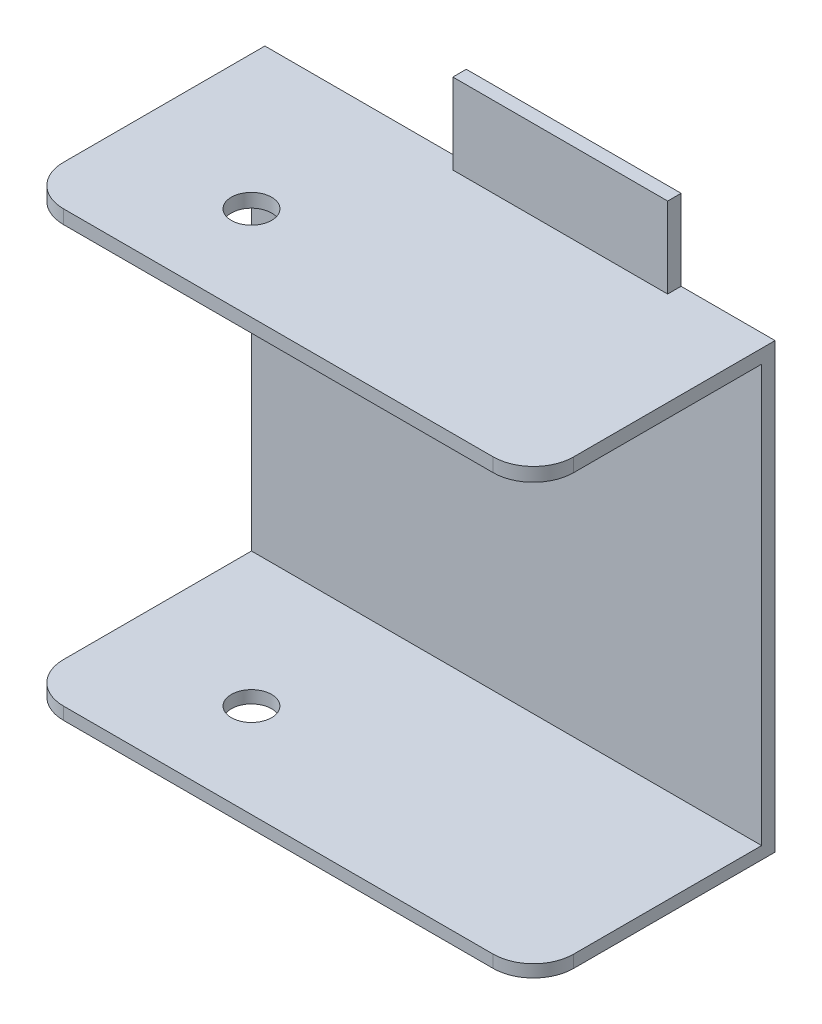
ISO-10303-21;
HEADER;
FILE_DESCRIPTION(('STEP AP214'),'2;1');
FILE_NAME('part.step','',(''),(''),'','','');
FILE_SCHEMA(('AUTOMOTIVE_DESIGN { 1 0 10303 214 1 1 1 1 }'));
ENDSEC;
DATA;
#1=APPLICATION_CONTEXT('core data for automotive mechanical design processes');
#2=APPLICATION_PROTOCOL_DEFINITION('international standard','automotive_design',2000,#1);
#3=PRODUCT_CONTEXT('',#1,'mechanical');
#4=PRODUCT('Part','Part','',(#3));
#5=PRODUCT_RELATED_PRODUCT_CATEGORY('part','',(#4));
#6=PRODUCT_DEFINITION_FORMATION('','',#4);
#7=PRODUCT_DEFINITION_CONTEXT('part definition',#1,'design');
#8=PRODUCT_DEFINITION('design','',#6,#7);
#9=PRODUCT_DEFINITION_SHAPE('','',#8);
#10=(LENGTH_UNIT() NAMED_UNIT(*) SI_UNIT(.MILLI.,.METRE.));
#11=(NAMED_UNIT(*) PLANE_ANGLE_UNIT() SI_UNIT($,.RADIAN.));
#12=(NAMED_UNIT(*) SI_UNIT($,.STERADIAN.) SOLID_ANGLE_UNIT());
#13=UNCERTAINTY_MEASURE_WITH_UNIT(LENGTH_MEASURE(1.E-05),#10,'distance_accuracy_value','');
#14=(GEOMETRIC_REPRESENTATION_CONTEXT(3) GLOBAL_UNCERTAINTY_ASSIGNED_CONTEXT((#13)) GLOBAL_UNIT_ASSIGNED_CONTEXT((#10,
#11,#12)) REPRESENTATION_CONTEXT('',''));
#15=CARTESIAN_POINT('',(0.,0.,0.));
#16=DIRECTION('',(0.,0.,1.));
#17=DIRECTION('',(1.,0.,0.));
#18=AXIS2_PLACEMENT_3D('',#15,#16,#17);
#19=CARTESIAN_POINT('',(-37.9891725352113,10.7390180319361,1.));
#20=DIRECTION('',(0.,0.,1.));
#21=DIRECTION('',(1.,0.,0.));
#22=AXIS2_PLACEMENT_3D('',#19,#20,#21);
#23=PLANE('',#22);
#24=DIRECTION('',(0.,1.,0.));
#25=VECTOR('',#24,1.);
#26=CARTESIAN_POINT('',(-37.9891725352113,-28.2609819680639,1.));
#27=LINE('',#26,#25);
#28=CARTESIAN_POINT('',(-37.9891725352113,-28.2609819680639,1.));
#29=VERTEX_POINT('',#28);
#30=CARTESIAN_POINT('',(-37.9891725352113,-22.2609819680639,1.));
#31=VERTEX_POINT('',#30);
#32=EDGE_CURVE('E223',#29,#31,#27,.T.);
#33=ORIENTED_EDGE('',*,*,#32,.T.);
#34=DIRECTION('',(-1.,0.,0.));
#35=VECTOR('',#34,1.);
#36=CARTESIAN_POINT('',(-37.9891725352113,-22.2609819680639,1.));
#37=LINE('',#36,#35);
#38=CARTESIAN_POINT('',(-53.9891725352113,-22.2609819680639,1.));
#39=VERTEX_POINT('',#38);
#40=EDGE_CURVE('E237',#31,#39,#37,.T.);
#41=ORIENTED_EDGE('',*,*,#40,.T.);
#42=DIRECTION('',(0.,-1.,0.));
#43=VECTOR('',#42,1.);
#44=CARTESIAN_POINT('',(-53.9891725352113,-28.2609819680639,1.));
#45=LINE('',#44,#43);
#46=CARTESIAN_POINT('',(-53.9891725352113,-28.2609819680639,1.));
#47=VERTEX_POINT('',#46);
#48=EDGE_CURVE('E204',#39,#47,#45,.T.);
#49=ORIENTED_EDGE('',*,*,#48,.T.);
#50=DIRECTION('',(1.,0.,0.));
#51=VECTOR('',#50,1.);
#52=CARTESIAN_POINT('',(-53.9891725352113,-28.2609819680639,1.));
#53=LINE('',#52,#51);
#54=EDGE_CURVE('E207',#47,#29,#53,.T.);
#55=ORIENTED_EDGE('',*,*,#54,.T.);
#56=EDGE_LOOP('',(#33,#41,#49,#55));
#57=FACE_BOUND('',#56,.T.);
#58=ADVANCED_FACE('F36',(#57),#23,.T.);
#59=DIRECTION('',(0.,-1.,0.));
#60=VECTOR('',#59,1.);
#61=CARTESIAN_POINT('',(-68.9891725352113,10.7390180319361,1.));
#62=LINE('',#61,#60);
#63=CARTESIAN_POINT('',(-68.9891725352113,9.71774900362483,1.));
#64=VERTEX_POINT('',#63);
#65=CARTESIAN_POINT('',(-68.9891725352113,-21.3364550083257,1.));
#66=VERTEX_POINT('',#65);
#67=EDGE_CURVE('E182',#64,#66,#62,.T.);
#68=ORIENTED_EDGE('',*,*,#67,.T.);
#69=DIRECTION('',(-1.,0.,0.));
#70=VECTOR('',#69,1.);
#71=CARTESIAN_POINT('',(-68.9891725352113,-21.3364550083257,1.));
#72=LINE('',#71,#70);
#73=CARTESIAN_POINT('',(-30.9891725352113,-21.3364550083257,1.));
#74=VERTEX_POINT('',#73);
#75=EDGE_CURVE('E191',#74,#66,#72,.T.);
#76=ORIENTED_EDGE('',*,*,#75,.F.);
#77=DIRECTION('',(0.,1.,0.));
#78=VECTOR('',#77,1.);
#79=CARTESIAN_POINT('',(-30.9891725352113,10.7390180319361,1.));
#80=LINE('',#79,#78);
#81=CARTESIAN_POINT('',(-30.9891725352113,9.71774900362483,1.));
#82=VERTEX_POINT('',#81);
#83=EDGE_CURVE('E226',#74,#82,#80,.T.);
#84=ORIENTED_EDGE('',*,*,#83,.T.);
#85=DIRECTION('',(1.,0.,0.));
#86=VECTOR('',#85,1.);
#87=CARTESIAN_POINT('',(-68.9891725352113,9.71774900362483,1.));
#88=LINE('',#87,#86);
#89=EDGE_CURVE('E203',#64,#82,#88,.T.);
#90=ORIENTED_EDGE('',*,*,#89,.F.);
#91=EDGE_LOOP('',(#68,#76,#84,#90));
#92=FACE_BOUND('',#91,.T.);
#93=ADVANCED_FACE('F201',(#92),#23,.T.);
#94=DIRECTION('',(-1.,0.,0.));
#95=VECTOR('',#94,1.);
#96=CARTESIAN_POINT('',(-68.9891725352113,10.7390180319361,1.));
#97=LINE('',#96,#95);
#98=CARTESIAN_POINT('',(-37.9891725352113,10.7390180319361,1.));
#99=VERTEX_POINT('',#98);
#100=CARTESIAN_POINT('',(-53.9891725352113,10.7390180319361,1.));
#101=VERTEX_POINT('',#100);
#102=EDGE_CURVE('E240',#99,#101,#97,.T.);
#103=ORIENTED_EDGE('',*,*,#102,.F.);
#104=DIRECTION('',(0.,1.,0.));
#105=VECTOR('',#104,1.);
#106=CARTESIAN_POINT('',(-37.9891725352113,16.7390180319361,1.));
#107=LINE('',#106,#105);
#108=CARTESIAN_POINT('',(-37.9891725352113,16.7390180319361,1.));
#109=VERTEX_POINT('',#108);
#110=EDGE_CURVE('E272',#99,#109,#107,.T.);
#111=ORIENTED_EDGE('',*,*,#110,.T.);
#112=DIRECTION('',(-1.,0.,0.));
#113=VECTOR('',#112,1.);
#114=CARTESIAN_POINT('',(-53.9891725352113,16.7390180319361,1.));
#115=LINE('',#114,#113);
#116=CARTESIAN_POINT('',(-53.9891725352113,16.7390180319361,1.));
#117=VERTEX_POINT('',#116);
#118=EDGE_CURVE('E209',#109,#117,#115,.T.);
#119=ORIENTED_EDGE('',*,*,#118,.T.);
#120=DIRECTION('',(0.,-1.,0.));
#121=VECTOR('',#120,1.);
#122=CARTESIAN_POINT('',(-53.9891725352113,16.7390180319361,1.));
#123=LINE('',#122,#121);
#124=EDGE_CURVE('E205',#117,#101,#123,.T.);
#125=ORIENTED_EDGE('',*,*,#124,.T.);
#126=EDGE_LOOP('',(#103,#111,#119,#125));
#127=FACE_BOUND('',#126,.T.);
#128=ADVANCED_FACE('F345',(#127),#23,.T.);
#129=CARTESIAN_POINT('',(-37.9891725352113,16.7390180319361,1.));
#130=DIRECTION('',(-1.,0.,0.));
#131=DIRECTION('',(0.,0.,1.));
#132=AXIS2_PLACEMENT_3D('',#129,#130,#131);
#133=PLANE('',#132);
#134=DIRECTION('',(0.,1.,0.));
#135=VECTOR('',#134,1.);
#136=CARTESIAN_POINT('',(-37.9891725352113,16.7390180319361,0.));
#137=LINE('',#136,#135);
#138=CARTESIAN_POINT('',(-37.9891725352113,10.7390180319361,0.));
#139=VERTEX_POINT('',#138);
#140=CARTESIAN_POINT('',(-37.9891725352113,16.7390180319361,0.));
#141=VERTEX_POINT('',#140);
#142=EDGE_CURVE('E332',#139,#141,#137,.T.);
#143=ORIENTED_EDGE('',*,*,#142,.T.);
#144=DIRECTION('',(0.,0.,-1.));
#145=VECTOR('',#144,1.);
#146=CARTESIAN_POINT('',(-37.9891725352113,16.7390180319361,1.));
#147=LINE('',#146,#145);
#148=EDGE_CURVE('E214',#109,#141,#147,.T.);
#149=ORIENTED_EDGE('',*,*,#148,.F.);
#150=ORIENTED_EDGE('',*,*,#110,.F.);
#151=DIRECTION('',(0.,0.,-1.));
#152=VECTOR('',#151,1.);
#153=CARTESIAN_POINT('',(-37.9891725352113,10.7390180319361,1.));
#154=LINE('',#153,#152);
#155=EDGE_CURVE('E261',#99,#139,#154,.T.);
#156=ORIENTED_EDGE('',*,*,#155,.T.);
#157=EDGE_LOOP('',(#143,#149,#150,#156));
#158=FACE_BOUND('',#157,.T.);
#159=ADVANCED_FACE('F346',(#158),#133,.F.);
#160=CARTESIAN_POINT('',(-53.9891725352113,16.7390180319361,1.));
#161=DIRECTION('',(0.,-1.,0.));
#162=DIRECTION('',(0.,0.,-1.));
#163=AXIS2_PLACEMENT_3D('',#160,#161,#162);
#164=PLANE('',#163);
#165=DIRECTION('',(-1.,0.,0.));
#166=VECTOR('',#165,1.);
#167=CARTESIAN_POINT('',(-53.9891725352113,16.7390180319361,0.));
#168=LINE('',#167,#166);
#169=CARTESIAN_POINT('',(-53.9891725352113,16.7390180319361,0.));
#170=VERTEX_POINT('',#169);
#171=EDGE_CURVE('E331',#141,#170,#168,.T.);
#172=ORIENTED_EDGE('',*,*,#171,.T.);
#173=DIRECTION('',(0.,0.,-1.));
#174=VECTOR('',#173,1.);
#175=CARTESIAN_POINT('',(-53.9891725352113,16.7390180319361,1.));
#176=LINE('',#175,#174);
#177=EDGE_CURVE('E268',#117,#170,#176,.T.);
#178=ORIENTED_EDGE('',*,*,#177,.F.);
#179=ORIENTED_EDGE('',*,*,#118,.F.);
#180=ORIENTED_EDGE('',*,*,#148,.T.);
#181=EDGE_LOOP('',(#172,#178,#179,#180));
#182=FACE_BOUND('',#181,.T.);
#183=ADVANCED_FACE('F341',(#182),#164,.F.);
#184=CARTESIAN_POINT('',(-53.9891725352113,16.7390180319361,1.));
#185=DIRECTION('',(1.,0.,0.));
#186=DIRECTION('',(0.,0.,-1.));
#187=AXIS2_PLACEMENT_3D('',#184,#185,#186);
#188=PLANE('',#187);
#189=DIRECTION('',(0.,-1.,0.));
#190=VECTOR('',#189,1.);
#191=CARTESIAN_POINT('',(-53.9891725352113,16.7390180319361,0.));
#192=LINE('',#191,#190);
#193=CARTESIAN_POINT('',(-53.9891725352113,10.7390180319361,0.));
#194=VERTEX_POINT('',#193);
#195=EDGE_CURVE('E329',#170,#194,#192,.T.);
#196=ORIENTED_EDGE('',*,*,#195,.T.);
#197=DIRECTION('',(0.,0.,-1.));
#198=VECTOR('',#197,1.);
#199=CARTESIAN_POINT('',(-53.9891725352113,10.7390180319361,1.));
#200=LINE('',#199,#198);
#201=EDGE_CURVE('E265',#101,#194,#200,.T.);
#202=ORIENTED_EDGE('',*,*,#201,.F.);
#203=ORIENTED_EDGE('',*,*,#124,.F.);
#204=ORIENTED_EDGE('',*,*,#177,.T.);
#205=EDGE_LOOP('',(#196,#202,#203,#204));
#206=FACE_BOUND('',#205,.T.);
#207=ADVANCED_FACE('F343',(#206),#188,.F.);
#208=CARTESIAN_POINT('',(-68.9891725352113,10.7390180319361,1.));
#209=DIRECTION('',(0.,-1.,0.));
#210=DIRECTION('',(0.,0.,-1.));
#211=AXIS2_PLACEMENT_3D('',#208,#209,#210);
#212=PLANE('',#211);
#213=CARTESIAN_POINT('',(-58.9891725352113,10.7390180319361,11.));
#214=DIRECTION('',(0.,1.,0.));
#215=DIRECTION('',(0.,0.,1.));
#216=AXIS2_PLACEMENT_3D('',#213,#214,#215);
#217=CIRCLE('',#216,1.5);
#218=CARTESIAN_POINT('',(-58.9891725352113,10.7390180319361,12.5));
#219=VERTEX_POINT('',#218);
#220=EDGE_CURVE('E638',#219,#219,#217,.T.);
#221=ORIENTED_EDGE('',*,*,#220,.F.);
#222=EDGE_LOOP('',(#221));
#223=FACE_BOUND('',#222,.T.);
#224=DIRECTION('',(-1.,0.,0.));
#225=VECTOR('',#224,1.);
#226=CARTESIAN_POINT('',(-68.9891725352113,10.7390180319361,18.));
#227=LINE('',#226,#225);
#228=CARTESIAN_POINT('',(-33.9891725352113,10.7390180319361,18.));
#229=VERTEX_POINT('',#228);
#230=CARTESIAN_POINT('',(-65.9891725352113,10.7390180319361,18.));
#231=VERTEX_POINT('',#230);
#232=EDGE_CURVE('E656',#229,#231,#227,.T.);
#233=ORIENTED_EDGE('',*,*,#232,.F.);
#234=CARTESIAN_POINT('',(-33.9891725352113,10.7390180319361,15.));
#235=DIRECTION('',(0.,-1.,0.));
#236=DIRECTION('',(0.,0.,-1.));
#237=AXIS2_PLACEMENT_3D('',#234,#235,#236);
#238=CIRCLE('',#237,3.);
#239=CARTESIAN_POINT('',(-30.9891725352113,10.7390180319361,15.));
#240=VERTEX_POINT('',#239);
#241=EDGE_CURVE('E60',#229,#240,#238,.F.);
#242=ORIENTED_EDGE('',*,*,#241,.T.);
#243=DIRECTION('',(0.,0.,-1.));
#244=VECTOR('',#243,1.);
#245=CARTESIAN_POINT('',(-30.9891725352113,10.7390180319361,1.));
#246=LINE('',#245,#244);
#247=CARTESIAN_POINT('',(-30.9891725352113,10.7390180319361,0.));
#248=VERTEX_POINT('',#247);
#249=EDGE_CURVE('E234',#240,#248,#246,.T.);
#250=ORIENTED_EDGE('',*,*,#249,.T.);
#251=DIRECTION('',(-1.,0.,0.));
#252=VECTOR('',#251,1.);
#253=CARTESIAN_POINT('',(-37.9891725352113,10.7390180319361,0.));
#254=LINE('',#253,#252);
#255=EDGE_CURVE('E229',#248,#139,#254,.T.);
#256=ORIENTED_EDGE('',*,*,#255,.T.);
#257=ORIENTED_EDGE('',*,*,#155,.F.);
#258=ORIENTED_EDGE('',*,*,#102,.T.);
#259=ORIENTED_EDGE('',*,*,#201,.T.);
#260=DIRECTION('',(-1.,0.,0.));
#261=VECTOR('',#260,1.);
#262=CARTESIAN_POINT('',(-68.9891725352113,10.7390180319361,0.));
#263=LINE('',#262,#261);
#264=CARTESIAN_POINT('',(-68.9891725352113,10.7390180319361,0.));
#265=VERTEX_POINT('',#264);
#266=EDGE_CURVE('E326',#194,#265,#263,.T.);
#267=ORIENTED_EDGE('',*,*,#266,.T.);
#268=DIRECTION('',(0.,0.,-1.));
#269=VECTOR('',#268,1.);
#270=CARTESIAN_POINT('',(-68.9891725352113,10.7390180319361,1.));
#271=LINE('',#270,#269);
#272=CARTESIAN_POINT('',(-68.9891725352113,10.7390180319361,15.));
#273=VERTEX_POINT('',#272);
#274=EDGE_CURVE('E269',#273,#265,#271,.T.);
#275=ORIENTED_EDGE('',*,*,#274,.F.);
#276=CARTESIAN_POINT('',(-65.9891725352113,10.7390180319361,15.));
#277=DIRECTION('',(0.,-1.,0.));
#278=DIRECTION('',(0.,0.,-1.));
#279=AXIS2_PLACEMENT_3D('',#276,#277,#278);
#280=CIRCLE('',#279,3.);
#281=EDGE_CURVE('E52',#273,#231,#280,.F.);
#282=ORIENTED_EDGE('',*,*,#281,.T.);
#283=EDGE_LOOP('',(#233,#242,#250,#256,#257,#258,#259,#267,#275,#282));
#284=FACE_BOUND('',#283,.T.);
#285=ADVANCED_FACE('F334',(#223,#284),#212,.F.);
#286=CARTESIAN_POINT('',(-68.9891725352113,10.7390180319361,1.));
#287=DIRECTION('',(1.,0.,0.));
#288=DIRECTION('',(0.,0.,-1.));
#289=AXIS2_PLACEMENT_3D('',#286,#287,#288);
#290=PLANE('',#289);
#291=DIRECTION('',(0.,0.,-1.));
#292=VECTOR('',#291,1.);
#293=CARTESIAN_POINT('',(-68.9891725352113,-22.2609819680639,1.));
#294=LINE('',#293,#292);
#295=CARTESIAN_POINT('',(-68.9891725352113,-22.2609819680639,15.));
#296=VERTEX_POINT('',#295);
#297=CARTESIAN_POINT('',(-68.9891725352113,-22.2609819680639,0.));
#298=VERTEX_POINT('',#297);
#299=EDGE_CURVE('E293',#296,#298,#294,.T.);
#300=ORIENTED_EDGE('',*,*,#299,.F.);
#301=DIRECTION('',(0.,-1.,0.));
#302=VECTOR('',#301,1.);
#303=CARTESIAN_POINT('',(-68.9891725352113,10.7390180319361,15.));
#304=LINE('',#303,#302);
#305=CARTESIAN_POINT('',(-68.9891725352113,-21.3364550083257,15.));
#306=VERTEX_POINT('',#305);
#307=EDGE_CURVE('E184',#296,#306,#304,.F.);
#308=ORIENTED_EDGE('',*,*,#307,.T.);
#309=DIRECTION('',(0.,0.,-1.));
#310=VECTOR('',#309,1.);
#311=CARTESIAN_POINT('',(-68.9891725352113,-21.3364550083257,18.));
#312=LINE('',#311,#310);
#313=EDGE_CURVE('E176',#306,#66,#312,.T.);
#314=ORIENTED_EDGE('',*,*,#313,.T.);
#315=ORIENTED_EDGE('',*,*,#67,.F.);
#316=DIRECTION('',(0.,0.,-1.));
#317=VECTOR('',#316,1.);
#318=CARTESIAN_POINT('',(-68.9891725352113,9.71774900362483,18.));
#319=LINE('',#318,#317);
#320=CARTESIAN_POINT('',(-68.9891725352113,9.71774900362483,15.));
#321=VERTEX_POINT('',#320);
#322=EDGE_CURVE('E251',#321,#64,#319,.T.);
#323=ORIENTED_EDGE('',*,*,#322,.F.);
#324=DIRECTION('',(0.,-1.,0.));
#325=VECTOR('',#324,1.);
#326=CARTESIAN_POINT('',(-68.9891725352113,10.7390180319361,15.));
#327=LINE('',#326,#325);
#328=EDGE_CURVE('E250',#321,#273,#327,.F.);
#329=ORIENTED_EDGE('',*,*,#328,.T.);
#330=ORIENTED_EDGE('',*,*,#274,.T.);
#331=DIRECTION('',(0.,-1.,0.));
#332=VECTOR('',#331,1.);
#333=CARTESIAN_POINT('',(-68.9891725352113,10.7390180319361,0.));
#334=LINE('',#333,#332);
#335=EDGE_CURVE('E323',#265,#298,#334,.T.);
#336=ORIENTED_EDGE('',*,*,#335,.T.);
#337=EDGE_LOOP('',(#300,#308,#314,#315,#323,#329,#330,#336));
#338=FACE_BOUND('',#337,.T.);
#339=ADVANCED_FACE('F179',(#338),#290,.F.);
#340=CARTESIAN_POINT('',(-53.9891725352113,-28.2609819680639,1.));
#341=DIRECTION('',(1.,0.,0.));
#342=DIRECTION('',(0.,0.,-1.));
#343=AXIS2_PLACEMENT_3D('',#340,#341,#342);
#344=PLANE('',#343);
#345=DIRECTION('',(0.,-1.,0.));
#346=VECTOR('',#345,1.);
#347=CARTESIAN_POINT('',(-53.9891725352113,-28.2609819680639,0.));
#348=LINE('',#347,#346);
#349=CARTESIAN_POINT('',(-53.9891725352113,-22.2609819680639,0.));
#350=VERTEX_POINT('',#349);
#351=CARTESIAN_POINT('',(-53.9891725352113,-28.2609819680639,0.));
#352=VERTEX_POINT('',#351);
#353=EDGE_CURVE('E319',#350,#352,#348,.T.);
#354=ORIENTED_EDGE('',*,*,#353,.T.);
#355=DIRECTION('',(0.,0.,-1.));
#356=VECTOR('',#355,1.);
#357=CARTESIAN_POINT('',(-53.9891725352113,-28.2609819680639,1.));
#358=LINE('',#357,#356);
#359=EDGE_CURVE('E298',#47,#352,#358,.T.);
#360=ORIENTED_EDGE('',*,*,#359,.F.);
#361=ORIENTED_EDGE('',*,*,#48,.F.);
#362=DIRECTION('',(0.,0.,-1.));
#363=VECTOR('',#362,1.);
#364=CARTESIAN_POINT('',(-53.9891725352113,-22.2609819680639,1.));
#365=LINE('',#364,#363);
#366=EDGE_CURVE('E295',#39,#350,#365,.T.);
#367=ORIENTED_EDGE('',*,*,#366,.T.);
#368=EDGE_LOOP('',(#354,#360,#361,#367));
#369=FACE_BOUND('',#368,.T.);
#370=ADVANCED_FACE('F382',(#369),#344,.F.);
#371=CARTESIAN_POINT('',(-53.9891725352113,-28.2609819680639,1.));
#372=DIRECTION('',(0.,1.,0.));
#373=DIRECTION('',(0.,0.,1.));
#374=AXIS2_PLACEMENT_3D('',#371,#372,#373);
#375=PLANE('',#374);
#376=DIRECTION('',(1.,0.,0.));
#377=VECTOR('',#376,1.);
#378=CARTESIAN_POINT('',(-53.9891725352113,-28.2609819680639,0.));
#379=LINE('',#378,#377);
#380=CARTESIAN_POINT('',(-37.9891725352113,-28.2609819680639,0.));
#381=VERTEX_POINT('',#380);
#382=EDGE_CURVE('E317',#352,#381,#379,.T.);
#383=ORIENTED_EDGE('',*,*,#382,.T.);
#384=DIRECTION('',(0.,0.,-1.));
#385=VECTOR('',#384,1.);
#386=CARTESIAN_POINT('',(-37.9891725352113,-28.2609819680639,1.));
#387=LINE('',#386,#385);
#388=EDGE_CURVE('E301',#29,#381,#387,.T.);
#389=ORIENTED_EDGE('',*,*,#388,.F.);
#390=ORIENTED_EDGE('',*,*,#54,.F.);
#391=ORIENTED_EDGE('',*,*,#359,.T.);
#392=EDGE_LOOP('',(#383,#389,#390,#391));
#393=FACE_BOUND('',#392,.T.);
#394=ADVANCED_FACE('F378',(#393),#375,.F.);
#395=CARTESIAN_POINT('',(-37.9891725352113,-28.2609819680639,1.));
#396=DIRECTION('',(-1.,0.,0.));
#397=DIRECTION('',(0.,0.,1.));
#398=AXIS2_PLACEMENT_3D('',#395,#396,#397);
#399=PLANE('',#398);
#400=DIRECTION('',(0.,1.,0.));
#401=VECTOR('',#400,1.);
#402=CARTESIAN_POINT('',(-37.9891725352113,-28.2609819680639,0.));
#403=LINE('',#402,#401);
#404=CARTESIAN_POINT('',(-37.9891725352113,-22.2609819680639,0.));
#405=VERTEX_POINT('',#404);
#406=EDGE_CURVE('E315',#381,#405,#403,.T.);
#407=ORIENTED_EDGE('',*,*,#406,.T.);
#408=DIRECTION('',(0.,0.,-1.));
#409=VECTOR('',#408,1.);
#410=CARTESIAN_POINT('',(-37.9891725352113,-22.2609819680639,1.));
#411=LINE('',#410,#409);
#412=EDGE_CURVE('E304',#31,#405,#411,.T.);
#413=ORIENTED_EDGE('',*,*,#412,.F.);
#414=ORIENTED_EDGE('',*,*,#32,.F.);
#415=ORIENTED_EDGE('',*,*,#388,.T.);
#416=EDGE_LOOP('',(#407,#413,#414,#415));
#417=FACE_BOUND('',#416,.T.);
#418=ADVANCED_FACE('F374',(#417),#399,.F.);
#419=CARTESIAN_POINT('',(-37.9891725352113,-22.2609819680639,1.));
#420=DIRECTION('',(0.,1.,0.));
#421=DIRECTION('',(0.,0.,1.));
#422=AXIS2_PLACEMENT_3D('',#419,#420,#421);
#423=PLANE('',#422);
#424=CARTESIAN_POINT('',(-58.9891725352113,-22.2609819680639,11.));
#425=DIRECTION('',(0.,1.,0.));
#426=DIRECTION('',(0.,0.,1.));
#427=AXIS2_PLACEMENT_3D('',#424,#425,#426);
#428=CIRCLE('',#427,1.5);
#429=CARTESIAN_POINT('',(-58.9891725352113,-22.2609819680639,12.5));
#430=VERTEX_POINT('',#429);
#431=EDGE_CURVE('E198',#430,#430,#428,.T.);
#432=ORIENTED_EDGE('',*,*,#431,.T.);
#433=EDGE_LOOP('',(#432));
#434=FACE_BOUND('',#433,.T.);
#435=DIRECTION('',(1.,0.,0.));
#436=VECTOR('',#435,1.);
#437=CARTESIAN_POINT('',(-68.9891725352113,-22.2609819680639,18.));
#438=LINE('',#437,#436);
#439=CARTESIAN_POINT('',(-65.9891725352113,-22.2609819680639,18.));
#440=VERTEX_POINT('',#439);
#441=CARTESIAN_POINT('',(-33.9891725352113,-22.2609819680639,18.));
#442=VERTEX_POINT('',#441);
#443=EDGE_CURVE('E197',#440,#442,#438,.T.);
#444=ORIENTED_EDGE('',*,*,#443,.F.);
#445=CARTESIAN_POINT('',(-65.9891725352113,-22.2609819680639,15.));
#446=DIRECTION('',(0.,1.,0.));
#447=DIRECTION('',(0.,0.,1.));
#448=AXIS2_PLACEMENT_3D('',#445,#446,#447);
#449=CIRCLE('',#448,3.);
#450=EDGE_CURVE('E248',#440,#296,#449,.F.);
#451=ORIENTED_EDGE('',*,*,#450,.T.);
#452=ORIENTED_EDGE('',*,*,#299,.T.);
#453=DIRECTION('',(1.,0.,0.));
#454=VECTOR('',#453,1.);
#455=CARTESIAN_POINT('',(-53.9891725352113,-22.2609819680639,0.));
#456=LINE('',#455,#454);
#457=EDGE_CURVE('E321',#298,#350,#456,.T.);
#458=ORIENTED_EDGE('',*,*,#457,.T.);
#459=ORIENTED_EDGE('',*,*,#366,.F.);
#460=ORIENTED_EDGE('',*,*,#40,.F.);
#461=ORIENTED_EDGE('',*,*,#412,.T.);
#462=DIRECTION('',(1.,0.,0.));
#463=VECTOR('',#462,1.);
#464=CARTESIAN_POINT('',(-37.9891725352113,-22.2609819680639,0.));
#465=LINE('',#464,#463);
#466=CARTESIAN_POINT('',(-30.9891725352113,-22.2609819680639,0.));
#467=VERTEX_POINT('',#466);
#468=EDGE_CURVE('E312',#405,#467,#465,.T.);
#469=ORIENTED_EDGE('',*,*,#468,.T.);
#470=DIRECTION('',(0.,0.,-1.));
#471=VECTOR('',#470,1.);
#472=CARTESIAN_POINT('',(-30.9891725352113,-22.2609819680639,1.));
#473=LINE('',#472,#471);
#474=CARTESIAN_POINT('',(-30.9891725352113,-22.2609819680639,15.));
#475=VERTEX_POINT('',#474);
#476=EDGE_CURVE('E307',#475,#467,#473,.T.);
#477=ORIENTED_EDGE('',*,*,#476,.F.);
#478=CARTESIAN_POINT('',(-33.9891725352113,-22.2609819680639,15.));
#479=DIRECTION('',(0.,1.,0.));
#480=DIRECTION('',(0.,0.,1.));
#481=AXIS2_PLACEMENT_3D('',#478,#479,#480);
#482=CIRCLE('',#481,3.);
#483=EDGE_CURVE('E246',#475,#442,#482,.F.);
#484=ORIENTED_EDGE('',*,*,#483,.T.);
#485=EDGE_LOOP('',(#444,#451,#452,#458,#459,#460,#461,#469,#477,#484));
#486=FACE_BOUND('',#485,.T.);
#487=ADVANCED_FACE('F370',(#434,#486),#423,.F.);
#488=CARTESIAN_POINT('',(-30.9891725352113,10.7390180319361,1.));
#489=DIRECTION('',(-1.,0.,0.));
#490=DIRECTION('',(0.,-1.,0.));
#491=AXIS2_PLACEMENT_3D('',#488,#489,#490);
#492=PLANE('',#491);
#493=DIRECTION('',(0.,0.,-1.));
#494=VECTOR('',#493,1.);
#495=CARTESIAN_POINT('',(-30.9891725352113,-21.3364550083257,18.));
#496=LINE('',#495,#494);
#497=CARTESIAN_POINT('',(-30.9891725352113,-21.3364550083257,15.));
#498=VERTEX_POINT('',#497);
#499=EDGE_CURVE('E187',#498,#74,#496,.T.);
#500=ORIENTED_EDGE('',*,*,#499,.F.);
#501=DIRECTION('',(0.,1.,0.));
#502=VECTOR('',#501,1.);
#503=CARTESIAN_POINT('',(-30.9891725352113,10.7390180319361,15.));
#504=LINE('',#503,#502);
#505=EDGE_CURVE('E673',#498,#475,#504,.F.);
#506=ORIENTED_EDGE('',*,*,#505,.T.);
#507=ORIENTED_EDGE('',*,*,#476,.T.);
#508=DIRECTION('',(0.,1.,0.));
#509=VECTOR('',#508,1.);
#510=CARTESIAN_POINT('',(-30.9891725352113,10.7390180319361,0.));
#511=LINE('',#510,#509);
#512=EDGE_CURVE('E274',#467,#248,#511,.T.);
#513=ORIENTED_EDGE('',*,*,#512,.T.);
#514=ORIENTED_EDGE('',*,*,#249,.F.);
#515=DIRECTION('',(0.,1.,0.));
#516=VECTOR('',#515,1.);
#517=CARTESIAN_POINT('',(-30.9891725352113,9.71774900362483,15.));
#518=LINE('',#517,#516);
#519=CARTESIAN_POINT('',(-30.9891725352113,9.71774900362483,15.));
#520=VERTEX_POINT('',#519);
#521=EDGE_CURVE('E670',#240,#520,#518,.F.);
#522=ORIENTED_EDGE('',*,*,#521,.T.);
#523=DIRECTION('',(0.,0.,-1.));
#524=VECTOR('',#523,1.);
#525=CARTESIAN_POINT('',(-30.9891725352113,9.71774900362483,18.));
#526=LINE('',#525,#524);
#527=EDGE_CURVE('E254',#520,#82,#526,.T.);
#528=ORIENTED_EDGE('',*,*,#527,.T.);
#529=ORIENTED_EDGE('',*,*,#83,.F.);
#530=EDGE_LOOP('',(#500,#506,#507,#513,#514,#522,#528,#529));
#531=FACE_BOUND('',#530,.T.);
#532=ADVANCED_FACE('F367',(#531),#492,.F.);
#533=CARTESIAN_POINT('',(-37.9891725352113,10.7390180319361,0.));
#534=DIRECTION('',(0.,0.,1.));
#535=DIRECTION('',(1.,0.,0.));
#536=AXIS2_PLACEMENT_3D('',#533,#534,#535);
#537=PLANE('',#536);
#538=ORIENTED_EDGE('',*,*,#255,.F.);
#539=ORIENTED_EDGE('',*,*,#512,.F.);
#540=ORIENTED_EDGE('',*,*,#468,.F.);
#541=ORIENTED_EDGE('',*,*,#406,.F.);
#542=ORIENTED_EDGE('',*,*,#382,.F.);
#543=ORIENTED_EDGE('',*,*,#353,.F.);
#544=ORIENTED_EDGE('',*,*,#457,.F.);
#545=ORIENTED_EDGE('',*,*,#335,.F.);
#546=ORIENTED_EDGE('',*,*,#266,.F.);
#547=ORIENTED_EDGE('',*,*,#195,.F.);
#548=ORIENTED_EDGE('',*,*,#171,.F.);
#549=ORIENTED_EDGE('',*,*,#142,.F.);
#550=EDGE_LOOP('',(#538,#539,#540,#541,#542,#543,#544,#545,#546,#547,#548,#549));
#551=FACE_BOUND('',#550,.T.);
#552=ADVANCED_FACE('F338',(#551),#537,.F.);
#553=CARTESIAN_POINT('',(-68.9891725352113,9.71774900362483,18.));
#554=DIRECTION('',(0.,1.,0.));
#555=DIRECTION('',(0.,0.,1.));
#556=AXIS2_PLACEMENT_3D('',#553,#554,#555);
#557=PLANE('',#556);
#558=CARTESIAN_POINT('',(-58.9891725352113,9.71774900362483,11.));
#559=DIRECTION('',(0.,1.,0.));
#560=DIRECTION('',(0.,0.,1.));
#561=AXIS2_PLACEMENT_3D('',#558,#559,#560);
#562=CIRCLE('',#561,1.5);
#563=CARTESIAN_POINT('',(-58.9891725352113,9.71774900362483,12.5));
#564=VERTEX_POINT('',#563);
#565=EDGE_CURVE('E641',#564,#564,#562,.T.);
#566=ORIENTED_EDGE('',*,*,#565,.T.);
#567=EDGE_LOOP('',(#566));
#568=FACE_BOUND('',#567,.T.);
#569=ORIENTED_EDGE('',*,*,#527,.F.);
#570=CARTESIAN_POINT('',(-33.9891725352113,9.71774900362483,15.));
#571=DIRECTION('',(0.,1.,0.));
#572=DIRECTION('',(0.,0.,1.));
#573=AXIS2_PLACEMENT_3D('',#570,#571,#572);
#574=CIRCLE('',#573,3.);
#575=CARTESIAN_POINT('',(-33.9891725352113,9.71774900362483,18.));
#576=VERTEX_POINT('',#575);
#577=EDGE_CURVE('E11',#520,#576,#574,.F.);
#578=ORIENTED_EDGE('',*,*,#577,.T.);
#579=DIRECTION('',(1.,0.,0.));
#580=VECTOR('',#579,1.);
#581=CARTESIAN_POINT('',(-68.9891725352113,9.71774900362483,18.));
#582=LINE('',#581,#580);
#583=CARTESIAN_POINT('',(-65.9891725352113,9.71774900362483,18.));
#584=VERTEX_POINT('',#583);
#585=EDGE_CURVE('E653',#584,#576,#582,.T.);
#586=ORIENTED_EDGE('',*,*,#585,.F.);
#587=CARTESIAN_POINT('',(-65.9891725352113,9.71774900362483,15.));
#588=DIRECTION('',(0.,1.,0.));
#589=DIRECTION('',(0.,0.,1.));
#590=AXIS2_PLACEMENT_3D('',#587,#588,#589);
#591=CIRCLE('',#590,3.);
#592=EDGE_CURVE('E45',#584,#321,#591,.F.);
#593=ORIENTED_EDGE('',*,*,#592,.T.);
#594=ORIENTED_EDGE('',*,*,#322,.T.);
#595=ORIENTED_EDGE('',*,*,#89,.T.);
#596=EDGE_LOOP('',(#569,#578,#586,#593,#594,#595));
#597=FACE_BOUND('',#596,.T.);
#598=ADVANCED_FACE('F363',(#568,#597),#557,.F.);
#599=CARTESIAN_POINT('',(-68.9891725352113,9.71774900362483,18.));
#600=DIRECTION('',(0.,0.,1.));
#601=DIRECTION('',(1.,0.,0.));
#602=AXIS2_PLACEMENT_3D('',#599,#600,#601);
#603=PLANE('',#602);
#604=ORIENTED_EDGE('',*,*,#585,.T.);
#605=DIRECTION('',(0.,1.,0.));
#606=VECTOR('',#605,1.);
#607=CARTESIAN_POINT('',(-33.9891725352113,10.7390180319361,18.));
#608=LINE('',#607,#606);
#609=EDGE_CURVE('E677',#576,#229,#608,.T.);
#610=ORIENTED_EDGE('',*,*,#609,.T.);
#611=ORIENTED_EDGE('',*,*,#232,.T.);
#612=DIRECTION('',(0.,-1.,0.));
#613=VECTOR('',#612,1.);
#614=CARTESIAN_POINT('',(-65.9891725352113,9.71774900362483,18.));
#615=LINE('',#614,#613);
#616=EDGE_CURVE('E675',#231,#584,#615,.T.);
#617=ORIENTED_EDGE('',*,*,#616,.T.);
#618=EDGE_LOOP('',(#604,#610,#611,#617));
#619=FACE_BOUND('',#618,.T.);
#620=ADVANCED_FACE('F437',(#619),#603,.T.);
#621=CARTESIAN_POINT('',(-68.9891725352113,-21.3364550083257,18.));
#622=DIRECTION('',(0.,-1.,0.));
#623=DIRECTION('',(0.,0.,-1.));
#624=AXIS2_PLACEMENT_3D('',#621,#622,#623);
#625=PLANE('',#624);
#626=CARTESIAN_POINT('',(-58.9891725352113,-21.3364550083257,11.));
#627=DIRECTION('',(0.,-1.,0.));
#628=DIRECTION('',(0.,0.,-1.));
#629=AXIS2_PLACEMENT_3D('',#626,#627,#628);
#630=CIRCLE('',#629,1.5);
#631=CARTESIAN_POINT('',(-58.9891725352113,-21.3364550083257,9.5));
#632=VERTEX_POINT('',#631);
#633=EDGE_CURVE('E40',#632,#632,#630,.T.);
#634=ORIENTED_EDGE('',*,*,#633,.T.);
#635=EDGE_LOOP('',(#634));
#636=FACE_BOUND('',#635,.T.);
#637=ORIENTED_EDGE('',*,*,#313,.F.);
#638=CARTESIAN_POINT('',(-65.9891725352113,-21.3364550083257,15.));
#639=DIRECTION('',(0.,-1.,0.));
#640=DIRECTION('',(0.,0.,-1.));
#641=AXIS2_PLACEMENT_3D('',#638,#639,#640);
#642=CIRCLE('',#641,3.);
#643=CARTESIAN_POINT('',(-65.9891725352113,-21.3364550083257,18.));
#644=VERTEX_POINT('',#643);
#645=EDGE_CURVE('E666',#306,#644,#642,.F.);
#646=ORIENTED_EDGE('',*,*,#645,.T.);
#647=DIRECTION('',(-1.,0.,0.));
#648=VECTOR('',#647,1.);
#649=CARTESIAN_POINT('',(-68.9891725352113,-21.3364550083257,18.));
#650=LINE('',#649,#648);
#651=CARTESIAN_POINT('',(-33.9891725352113,-21.3364550083257,18.));
#652=VERTEX_POINT('',#651);
#653=EDGE_CURVE('E188',#652,#644,#650,.T.);
#654=ORIENTED_EDGE('',*,*,#653,.F.);
#655=CARTESIAN_POINT('',(-33.9891725352113,-21.3364550083257,15.));
#656=DIRECTION('',(0.,-1.,0.));
#657=DIRECTION('',(0.,0.,-1.));
#658=AXIS2_PLACEMENT_3D('',#655,#656,#657);
#659=CIRCLE('',#658,3.);
#660=EDGE_CURVE('E665',#652,#498,#659,.F.);
#661=ORIENTED_EDGE('',*,*,#660,.T.);
#662=ORIENTED_EDGE('',*,*,#499,.T.);
#663=ORIENTED_EDGE('',*,*,#75,.T.);
#664=EDGE_LOOP('',(#637,#646,#654,#661,#662,#663));
#665=FACE_BOUND('',#664,.T.);
#666=ADVANCED_FACE('F192',(#636,#665),#625,.F.);
#667=CARTESIAN_POINT('',(-68.9891725352113,-21.3364550083257,18.));
#668=DIRECTION('',(0.,0.,-1.));
#669=DIRECTION('',(-1.,0.,0.));
#670=AXIS2_PLACEMENT_3D('',#667,#668,#669);
#671=PLANE('',#670);
#672=ORIENTED_EDGE('',*,*,#653,.T.);
#673=DIRECTION('',(0.,-1.,0.));
#674=VECTOR('',#673,1.);
#675=CARTESIAN_POINT('',(-65.9891725352113,-21.3364550083257,18.));
#676=LINE('',#675,#674);
#677=EDGE_CURVE('E243',#644,#440,#676,.T.);
#678=ORIENTED_EDGE('',*,*,#677,.T.);
#679=ORIENTED_EDGE('',*,*,#443,.T.);
#680=DIRECTION('',(0.,1.,0.));
#681=VECTOR('',#680,1.);
#682=CARTESIAN_POINT('',(-33.9891725352113,-21.3364550083257,18.));
#683=LINE('',#682,#681);
#684=EDGE_CURVE('E239',#442,#652,#683,.T.);
#685=ORIENTED_EDGE('',*,*,#684,.T.);
#686=EDGE_LOOP('',(#672,#678,#679,#685));
#687=FACE_BOUND('',#686,.T.);
#688=ADVANCED_FACE('F450',(#687),#671,.F.);
#689=CARTESIAN_POINT('',(-65.9891725352113,-21.3364550083257,15.));
#690=DIRECTION('',(0.,-1.,0.));
#691=DIRECTION('',(0.,0.,-1.));
#692=AXIS2_PLACEMENT_3D('',#689,#690,#691);
#693=CYLINDRICAL_SURFACE('',#692,3.);
#694=ORIENTED_EDGE('',*,*,#645,.F.);
#695=ORIENTED_EDGE('',*,*,#307,.F.);
#696=ORIENTED_EDGE('',*,*,#450,.F.);
#697=ORIENTED_EDGE('',*,*,#677,.F.);
#698=EDGE_LOOP('',(#694,#695,#696,#697));
#699=FACE_BOUND('',#698,.T.);
#700=ADVANCED_FACE('F458',(#699),#693,.T.);
#701=CARTESIAN_POINT('',(-33.9891725352113,-21.3364550083257,15.));
#702=DIRECTION('',(0.,1.,0.));
#703=DIRECTION('',(-1.,0.,0.));
#704=AXIS2_PLACEMENT_3D('',#701,#702,#703);
#705=CYLINDRICAL_SURFACE('',#704,3.);
#706=ORIENTED_EDGE('',*,*,#483,.F.);
#707=ORIENTED_EDGE('',*,*,#505,.F.);
#708=ORIENTED_EDGE('',*,*,#660,.F.);
#709=ORIENTED_EDGE('',*,*,#684,.F.);
#710=EDGE_LOOP('',(#706,#707,#708,#709));
#711=FACE_BOUND('',#710,.T.);
#712=ADVANCED_FACE('F466',(#711),#705,.T.);
#713=CARTESIAN_POINT('',(-33.9891725352113,9.7177490036248,15.));
#714=DIRECTION('',(0.,-1.,0.));
#715=DIRECTION('',(1.,0.,0.));
#716=AXIS2_PLACEMENT_3D('',#713,#714,#715);
#717=CYLINDRICAL_SURFACE('',#716,3.);
#718=ORIENTED_EDGE('',*,*,#577,.F.);
#719=ORIENTED_EDGE('',*,*,#521,.F.);
#720=ORIENTED_EDGE('',*,*,#241,.F.);
#721=ORIENTED_EDGE('',*,*,#609,.F.);
#722=EDGE_LOOP('',(#718,#719,#720,#721));
#723=FACE_BOUND('',#722,.T.);
#724=ADVANCED_FACE('F473',(#723),#717,.T.);
#725=CARTESIAN_POINT('',(-65.9891725352113,9.71774900362483,15.));
#726=DIRECTION('',(0.,1.,0.));
#727=DIRECTION('',(0.,0.,1.));
#728=AXIS2_PLACEMENT_3D('',#725,#726,#727);
#729=CYLINDRICAL_SURFACE('',#728,3.);
#730=ORIENTED_EDGE('',*,*,#281,.F.);
#731=ORIENTED_EDGE('',*,*,#328,.F.);
#732=ORIENTED_EDGE('',*,*,#592,.F.);
#733=ORIENTED_EDGE('',*,*,#616,.F.);
#734=EDGE_LOOP('',(#730,#731,#732,#733));
#735=FACE_BOUND('',#734,.T.);
#736=ADVANCED_FACE('F38',(#735),#729,.T.);
#737=CARTESIAN_POINT('',(-58.9891725352113,-35.2609819680639,11.));
#738=DIRECTION('',(0.,1.,0.));
#739=DIRECTION('',(0.,0.,1.));
#740=AXIS2_PLACEMENT_3D('',#737,#738,#739);
#741=CYLINDRICAL_SURFACE('',#740,1.5);
#742=ORIENTED_EDGE('',*,*,#633,.F.);
#743=EDGE_LOOP('',(#742));
#744=FACE_BOUND('',#743,.T.);
#745=ORIENTED_EDGE('',*,*,#431,.F.);
#746=EDGE_LOOP('',(#745));
#747=FACE_BOUND('',#746,.T.);
#748=ADVANCED_FACE('F485',(#744,#747),#741,.F.);
#749=ORIENTED_EDGE('',*,*,#220,.T.);
#750=EDGE_LOOP('',(#749));
#751=FACE_BOUND('',#750,.T.);
#752=ORIENTED_EDGE('',*,*,#565,.F.);
#753=EDGE_LOOP('',(#752));
#754=FACE_BOUND('',#753,.T.);
#755=ADVANCED_FACE('F491',(#751,#754),#741,.F.);
#756=CLOSED_SHELL('',(#58,#93,#128,#159,#183,#207,#285,#339,#370,#394,#418,#487,#532,#552,#598,
#620,#666,#688,#700,#712,#724,#736,#748,#755));
#757=MANIFOLD_SOLID_BREP('B2',#756);
#758=ADVANCED_BREP_SHAPE_REPRESENTATION('',(#18,#757),#14);
#759=SHAPE_DEFINITION_REPRESENTATION(#9,#758);
ENDSEC;
END-ISO-10303-21;
